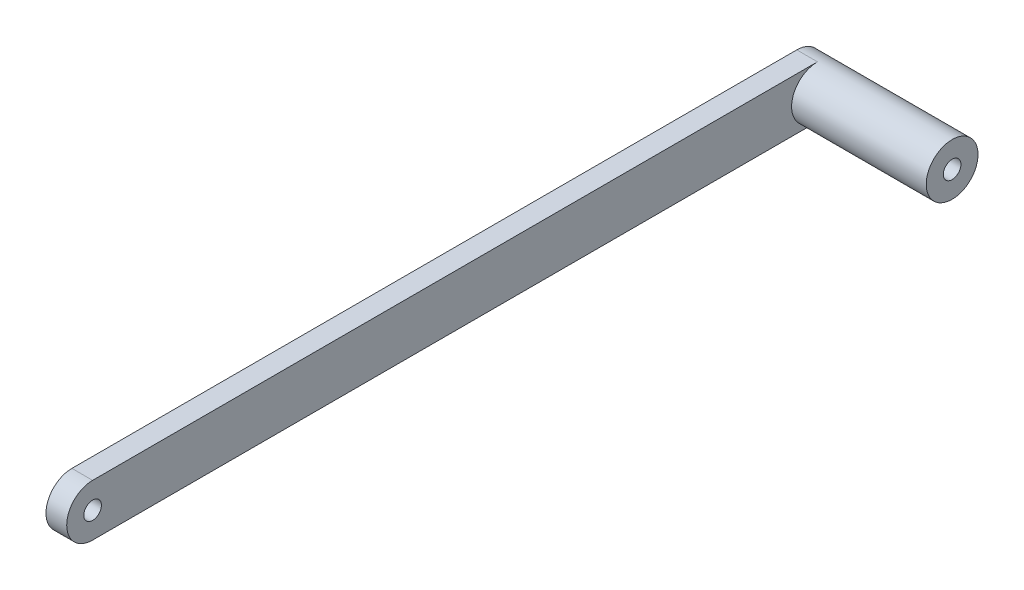
ISO-10303-21;
HEADER;
FILE_DESCRIPTION(('STEP AP214'),'2;1');
FILE_NAME('part.step','',(''),(''),'','','');
FILE_SCHEMA(('AUTOMOTIVE_DESIGN { 1 0 10303 214 1 1 1 1 }'));
ENDSEC;
DATA;
#1=APPLICATION_CONTEXT('core data for automotive mechanical design processes');
#2=APPLICATION_PROTOCOL_DEFINITION('international standard','automotive_design',2000,#1);
#3=PRODUCT_CONTEXT('',#1,'mechanical');
#4=PRODUCT('Part','Part','',(#3));
#5=PRODUCT_RELATED_PRODUCT_CATEGORY('part','',(#4));
#6=PRODUCT_DEFINITION_FORMATION('','',#4);
#7=PRODUCT_DEFINITION_CONTEXT('part definition',#1,'design');
#8=PRODUCT_DEFINITION('design','',#6,#7);
#9=PRODUCT_DEFINITION_SHAPE('','',#8);
#10=(LENGTH_UNIT() NAMED_UNIT(*) SI_UNIT(.MILLI.,.METRE.));
#11=(NAMED_UNIT(*) PLANE_ANGLE_UNIT() SI_UNIT($,.RADIAN.));
#12=(NAMED_UNIT(*) SI_UNIT($,.STERADIAN.) SOLID_ANGLE_UNIT());
#13=UNCERTAINTY_MEASURE_WITH_UNIT(LENGTH_MEASURE(1.E-05),#10,'distance_accuracy_value','');
#14=(GEOMETRIC_REPRESENTATION_CONTEXT(3) GLOBAL_UNCERTAINTY_ASSIGNED_CONTEXT((#13)) GLOBAL_UNIT_ASSIGNED_CONTEXT((#10,
#11,#12)) REPRESENTATION_CONTEXT('',''));
#15=CARTESIAN_POINT('',(0.,0.,0.));
#16=DIRECTION('',(0.,0.,1.));
#17=DIRECTION('',(1.,0.,0.));
#18=AXIS2_PLACEMENT_3D('',#15,#16,#17);
#19=CARTESIAN_POINT('',(2.,0.,35.));
#20=DIRECTION('',(-1.,0.,0.));
#21=DIRECTION('',(0.,0.,1.));
#22=AXIS2_PLACEMENT_3D('',#19,#20,#21);
#23=CYLINDRICAL_SURFACE('',#22,2.5);
#24=CARTESIAN_POINT('',(0.,0.,35.));
#25=DIRECTION('',(1.,0.,0.));
#26=DIRECTION('',(0.,0.,-1.));
#27=AXIS2_PLACEMENT_3D('',#24,#25,#26);
#28=CIRCLE('',#27,2.5);
#29=CARTESIAN_POINT('',(0.,2.5,35.));
#30=VERTEX_POINT('',#29);
#31=CARTESIAN_POINT('',(0.,-2.5,35.));
#32=VERTEX_POINT('',#31);
#33=EDGE_CURVE('E95',#30,#32,#28,.T.);
#34=ORIENTED_EDGE('',*,*,#33,.T.);
#35=DIRECTION('',(-1.,0.,0.));
#36=VECTOR('',#35,1.);
#37=CARTESIAN_POINT('',(2.,-2.5,35.));
#38=LINE('',#37,#36);
#39=CARTESIAN_POINT('',(2.,-2.5,35.));
#40=VERTEX_POINT('',#39);
#41=EDGE_CURVE('E11',#40,#32,#38,.T.);
#42=ORIENTED_EDGE('',*,*,#41,.F.);
#43=CARTESIAN_POINT('',(2.,0.,35.));
#44=DIRECTION('',(1.,0.,0.));
#45=DIRECTION('',(0.,0.,-1.));
#46=AXIS2_PLACEMENT_3D('',#43,#44,#45);
#47=CIRCLE('',#46,2.5);
#48=CARTESIAN_POINT('',(2.,2.5,35.));
#49=VERTEX_POINT('',#48);
#50=EDGE_CURVE('E101',#49,#40,#47,.T.);
#51=ORIENTED_EDGE('',*,*,#50,.F.);
#52=DIRECTION('',(-1.,0.,0.));
#53=VECTOR('',#52,1.);
#54=CARTESIAN_POINT('',(2.,2.5,35.));
#55=LINE('',#54,#53);
#56=EDGE_CURVE('E82',#49,#30,#55,.T.);
#57=ORIENTED_EDGE('',*,*,#56,.T.);
#58=EDGE_LOOP('',(#34,#42,#51,#57));
#59=FACE_BOUND('',#58,.T.);
#60=ADVANCED_FACE('F33',(#59),#23,.T.);
#61=CARTESIAN_POINT('',(2.,-2.5,35.));
#62=DIRECTION('',(0.,1.,0.));
#63=DIRECTION('',(0.,0.,1.));
#64=AXIS2_PLACEMENT_3D('',#61,#62,#63);
#65=PLANE('',#64);
#66=DIRECTION('',(0.,0.,-1.));
#67=VECTOR('',#66,1.);
#68=CARTESIAN_POINT('',(0.,-2.5,35.));
#69=LINE('',#68,#67);
#70=CARTESIAN_POINT('',(0.,-2.49999999999999,-35.));
#71=VERTEX_POINT('',#70);
#72=EDGE_CURVE('E106',#32,#71,#69,.T.);
#73=ORIENTED_EDGE('',*,*,#72,.T.);
#74=DIRECTION('',(-1.,0.,0.));
#75=VECTOR('',#74,1.);
#76=CARTESIAN_POINT('',(2.,-2.49999999999999,-35.));
#77=LINE('',#76,#75);
#78=CARTESIAN_POINT('',(2.,-2.49999999999999,-35.));
#79=VERTEX_POINT('',#78);
#80=EDGE_CURVE('E41',#79,#71,#77,.T.);
#81=ORIENTED_EDGE('',*,*,#80,.F.);
#82=DIRECTION('',(0.,0.,-1.));
#83=VECTOR('',#82,1.);
#84=CARTESIAN_POINT('',(2.,-2.5,35.));
#85=LINE('',#84,#83);
#86=EDGE_CURVE('E78',#40,#79,#85,.T.);
#87=ORIENTED_EDGE('',*,*,#86,.F.);
#88=ORIENTED_EDGE('',*,*,#41,.T.);
#89=EDGE_LOOP('',(#73,#81,#87,#88));
#90=FACE_BOUND('',#89,.T.);
#91=ADVANCED_FACE('F115',(#90),#65,.F.);
#92=CARTESIAN_POINT('',(2.,0.,-35.));
#93=DIRECTION('',(-1.,0.,0.));
#94=DIRECTION('',(0.,0.,1.));
#95=AXIS2_PLACEMENT_3D('',#92,#93,#94);
#96=CYLINDRICAL_SURFACE('',#95,2.5);
#97=CARTESIAN_POINT('',(0.,0.,-35.));
#98=DIRECTION('',(1.,0.,0.));
#99=DIRECTION('',(0.,0.,-1.));
#100=AXIS2_PLACEMENT_3D('',#97,#98,#99);
#101=CIRCLE('',#100,2.5);
#102=CARTESIAN_POINT('',(0.,2.50000000000001,-35.));
#103=VERTEX_POINT('',#102);
#104=EDGE_CURVE('E68',#71,#103,#101,.T.);
#105=ORIENTED_EDGE('',*,*,#104,.T.);
#106=DIRECTION('',(-1.,0.,0.));
#107=VECTOR('',#106,1.);
#108=CARTESIAN_POINT('',(2.,2.50000000000001,-35.));
#109=LINE('',#108,#107);
#110=CARTESIAN_POINT('',(2.,2.50000000000002,-35.));
#111=VERTEX_POINT('',#110);
#112=EDGE_CURVE('E81',#111,#103,#109,.T.);
#113=ORIENTED_EDGE('',*,*,#112,.F.);
#114=CARTESIAN_POINT('',(2.,0.,-35.));
#115=DIRECTION('',(1.,0.,0.));
#116=DIRECTION('',(0.,0.,-1.));
#117=AXIS2_PLACEMENT_3D('',#114,#115,#116);
#118=CIRCLE('',#117,2.5);
#119=EDGE_CURVE('E88',#111,#79,#118,.T.);
#120=ORIENTED_EDGE('',*,*,#119,.T.);
#121=ORIENTED_EDGE('',*,*,#80,.T.);
#122=EDGE_LOOP('',(#105,#113,#120,#121));
#123=FACE_BOUND('',#122,.T.);
#124=CARTESIAN_POINT('',(15.,0.,-35.));
#125=DIRECTION('',(1.,0.,0.));
#126=DIRECTION('',(0.,0.,-1.));
#127=AXIS2_PLACEMENT_3D('',#124,#125,#126);
#128=CIRCLE('',#127,2.5);
#129=CARTESIAN_POINT('',(15.,0.,-37.5));
#130=VERTEX_POINT('',#129);
#131=EDGE_CURVE('E91',#130,#130,#128,.T.);
#132=ORIENTED_EDGE('',*,*,#131,.F.);
#133=EDGE_LOOP('',(#132));
#134=FACE_BOUND('',#133,.T.);
#135=ADVANCED_FACE('F86',(#123,#134),#96,.T.);
#136=CARTESIAN_POINT('',(2.,2.5,35.));
#137=DIRECTION('',(0.,-1.,0.));
#138=DIRECTION('',(0.,0.,-1.));
#139=AXIS2_PLACEMENT_3D('',#136,#137,#138);
#140=PLANE('',#139);
#141=DIRECTION('',(0.,0.,1.));
#142=VECTOR('',#141,1.);
#143=CARTESIAN_POINT('',(0.,2.5,35.));
#144=LINE('',#143,#142);
#145=EDGE_CURVE('E73',#103,#30,#144,.T.);
#146=ORIENTED_EDGE('',*,*,#145,.T.);
#147=ORIENTED_EDGE('',*,*,#56,.F.);
#148=DIRECTION('',(0.,0.,1.));
#149=VECTOR('',#148,1.);
#150=CARTESIAN_POINT('',(2.,2.5,35.));
#151=LINE('',#150,#149);
#152=EDGE_CURVE('E49',#111,#49,#151,.T.);
#153=ORIENTED_EDGE('',*,*,#152,.F.);
#154=ORIENTED_EDGE('',*,*,#112,.T.);
#155=EDGE_LOOP('',(#146,#147,#153,#154));
#156=FACE_BOUND('',#155,.T.);
#157=ADVANCED_FACE('F80',(#156),#140,.F.);
#158=CARTESIAN_POINT('',(2.,0.,35.));
#159=DIRECTION('',(1.,0.,0.));
#160=DIRECTION('',(0.,0.,-1.));
#161=AXIS2_PLACEMENT_3D('',#158,#159,#160);
#162=PLANE('',#161);
#163=CARTESIAN_POINT('',(2.,0.,35.));
#164=DIRECTION('',(1.,0.,0.));
#165=DIRECTION('',(0.,0.,-1.));
#166=AXIS2_PLACEMENT_3D('',#163,#164,#165);
#167=CIRCLE('',#166,0.850000000000007);
#168=CARTESIAN_POINT('',(2.,0.,34.15));
#169=VERTEX_POINT('',#168);
#170=EDGE_CURVE('E147',#169,#169,#167,.T.);
#171=ORIENTED_EDGE('',*,*,#170,.F.);
#172=EDGE_LOOP('',(#171));
#173=FACE_BOUND('',#172,.T.);
#174=ORIENTED_EDGE('',*,*,#119,.F.);
#175=ORIENTED_EDGE('',*,*,#152,.T.);
#176=ORIENTED_EDGE('',*,*,#50,.T.);
#177=ORIENTED_EDGE('',*,*,#86,.T.);
#178=EDGE_LOOP('',(#174,#175,#176,#177));
#179=FACE_BOUND('',#178,.T.);
#180=ADVANCED_FACE('F90',(#173,#179),#162,.T.);
#181=CARTESIAN_POINT('',(0.,0.,35.));
#182=DIRECTION('',(1.,0.,0.));
#183=DIRECTION('',(0.,0.,-1.));
#184=AXIS2_PLACEMENT_3D('',#181,#182,#183);
#185=PLANE('',#184);
#186=CARTESIAN_POINT('',(0.,0.,35.));
#187=DIRECTION('',(1.,0.,0.));
#188=DIRECTION('',(0.,0.,-1.));
#189=AXIS2_PLACEMENT_3D('',#186,#187,#188);
#190=CIRCLE('',#189,0.850000000000007);
#191=CARTESIAN_POINT('',(0.,0.,34.15));
#192=VERTEX_POINT('',#191);
#193=EDGE_CURVE('E150',#192,#192,#190,.F.);
#194=ORIENTED_EDGE('',*,*,#193,.F.);
#195=EDGE_LOOP('',(#194));
#196=FACE_BOUND('',#195,.T.);
#197=CARTESIAN_POINT('',(0.,0.,-35.));
#198=DIRECTION('',(1.,0.,0.));
#199=DIRECTION('',(0.,0.,-1.));
#200=AXIS2_PLACEMENT_3D('',#197,#198,#199);
#201=CIRCLE('',#200,0.850000000000007);
#202=CARTESIAN_POINT('',(0.,0.,-35.85));
#203=VERTEX_POINT('',#202);
#204=EDGE_CURVE('E92',#203,#203,#201,.F.);
#205=ORIENTED_EDGE('',*,*,#204,.F.);
#206=EDGE_LOOP('',(#205));
#207=FACE_BOUND('',#206,.T.);
#208=ORIENTED_EDGE('',*,*,#33,.F.);
#209=ORIENTED_EDGE('',*,*,#145,.F.);
#210=ORIENTED_EDGE('',*,*,#104,.F.);
#211=ORIENTED_EDGE('',*,*,#72,.F.);
#212=EDGE_LOOP('',(#208,#209,#210,#211));
#213=FACE_BOUND('',#212,.T.);
#214=ADVANCED_FACE('F112',(#196,#207,#213),#185,.F.);
#215=CARTESIAN_POINT('',(15.,0.,-35.));
#216=DIRECTION('',(1.,0.,0.));
#217=DIRECTION('',(0.,0.,-1.));
#218=AXIS2_PLACEMENT_3D('',#215,#216,#217);
#219=PLANE('',#218);
#220=CARTESIAN_POINT('',(15.,0.,-35.));
#221=DIRECTION('',(1.,0.,0.));
#222=DIRECTION('',(0.,0.,-1.));
#223=AXIS2_PLACEMENT_3D('',#220,#221,#222);
#224=CIRCLE('',#223,0.850000000000007);
#225=CARTESIAN_POINT('',(15.,0.,-35.85));
#226=VERTEX_POINT('',#225);
#227=EDGE_CURVE('E98',#226,#226,#224,.T.);
#228=ORIENTED_EDGE('',*,*,#227,.F.);
#229=EDGE_LOOP('',(#228));
#230=FACE_BOUND('',#229,.T.);
#231=ORIENTED_EDGE('',*,*,#131,.T.);
#232=EDGE_LOOP('',(#231));
#233=FACE_BOUND('',#232,.T.);
#234=ADVANCED_FACE('F127',(#230,#233),#219,.T.);
#235=CARTESIAN_POINT('',(-0.000999999999999265,0.,-35.));
#236=DIRECTION('',(1.,0.,0.));
#237=DIRECTION('',(0.,0.,-1.));
#238=AXIS2_PLACEMENT_3D('',#235,#236,#237);
#239=CYLINDRICAL_SURFACE('',#238,0.850000000000007);
#240=CARTESIAN_POINT('',(15.,0.,-35.85));
#241=CARTESIAN_POINT('',(14.84375,0.,-35.85));
#242=CARTESIAN_POINT('',(14.6875,0.,-35.85));
#243=CARTESIAN_POINT('',(14.375,0.,-35.85));
#244=CARTESIAN_POINT('',(14.21875,0.,-35.85));
#245=CARTESIAN_POINT('',(13.90625,0.,-35.85));
#246=CARTESIAN_POINT('',(13.75,0.,-35.85));
#247=CARTESIAN_POINT('',(13.4375,0.,-35.85));
#248=CARTESIAN_POINT('',(13.28125,0.,-35.85));
#249=CARTESIAN_POINT('',(12.96875,0.,-35.85));
#250=CARTESIAN_POINT('',(12.8125,0.,-35.85));
#251=CARTESIAN_POINT('',(12.5,0.,-35.85));
#252=CARTESIAN_POINT('',(12.34375,0.,-35.85));
#253=CARTESIAN_POINT('',(12.03125,0.,-35.85));
#254=CARTESIAN_POINT('',(11.875,0.,-35.85));
#255=CARTESIAN_POINT('',(11.5625,0.,-35.85));
#256=CARTESIAN_POINT('',(11.40625,0.,-35.85));
#257=CARTESIAN_POINT('',(11.09375,0.,-35.85));
#258=CARTESIAN_POINT('',(10.9375,0.,-35.85));
#259=CARTESIAN_POINT('',(10.625,0.,-35.85));
#260=CARTESIAN_POINT('',(10.46875,0.,-35.85));
#261=CARTESIAN_POINT('',(10.15625,0.,-35.85));
#262=CARTESIAN_POINT('',(10.,0.,-35.85));
#263=CARTESIAN_POINT('',(9.6875,0.,-35.85));
#264=CARTESIAN_POINT('',(9.53125,0.,-35.85));
#265=CARTESIAN_POINT('',(9.21875,0.,-35.85));
#266=CARTESIAN_POINT('',(9.0625,0.,-35.85));
#267=CARTESIAN_POINT('',(8.75,0.,-35.85));
#268=CARTESIAN_POINT('',(8.59375,0.,-35.85));
#269=CARTESIAN_POINT('',(8.28125,0.,-35.85));
#270=CARTESIAN_POINT('',(8.125,0.,-35.85));
#271=CARTESIAN_POINT('',(7.8125,0.,-35.85));
#272=CARTESIAN_POINT('',(7.65625,0.,-35.85));
#273=CARTESIAN_POINT('',(7.34375,0.,-35.85));
#274=CARTESIAN_POINT('',(7.1875,0.,-35.85));
#275=CARTESIAN_POINT('',(6.875,0.,-35.85));
#276=CARTESIAN_POINT('',(6.71875,0.,-35.85));
#277=CARTESIAN_POINT('',(6.40625,0.,-35.85));
#278=CARTESIAN_POINT('',(6.25,0.,-35.85));
#279=CARTESIAN_POINT('',(5.9375,0.,-35.85));
#280=CARTESIAN_POINT('',(5.78125,0.,-35.85));
#281=CARTESIAN_POINT('',(5.46875,0.,-35.85));
#282=CARTESIAN_POINT('',(5.3125,0.,-35.85));
#283=CARTESIAN_POINT('',(5.,0.,-35.85));
#284=CARTESIAN_POINT('',(4.84375,0.,-35.85));
#285=CARTESIAN_POINT('',(4.53125,0.,-35.85));
#286=CARTESIAN_POINT('',(4.375,0.,-35.85));
#287=CARTESIAN_POINT('',(4.0625,0.,-35.85));
#288=CARTESIAN_POINT('',(3.90625,0.,-35.85));
#289=CARTESIAN_POINT('',(3.59375,0.,-35.85));
#290=CARTESIAN_POINT('',(3.4375,0.,-35.85));
#291=CARTESIAN_POINT('',(3.125,0.,-35.85));
#292=CARTESIAN_POINT('',(2.96875,0.,-35.85));
#293=CARTESIAN_POINT('',(2.65625,0.,-35.85));
#294=CARTESIAN_POINT('',(2.5,0.,-35.85));
#295=CARTESIAN_POINT('',(2.1875,0.,-35.85));
#296=CARTESIAN_POINT('',(2.03125,0.,-35.85));
#297=CARTESIAN_POINT('',(1.71875,0.,-35.85));
#298=CARTESIAN_POINT('',(1.5625,0.,-35.85));
#299=CARTESIAN_POINT('',(1.25,0.,-35.85));
#300=CARTESIAN_POINT('',(1.09375,0.,-35.85));
#301=CARTESIAN_POINT('',(0.781250000000001,0.,-35.85));
#302=CARTESIAN_POINT('',(0.625,0.,-35.85));
#303=CARTESIAN_POINT('',(0.3125,0.,-35.85));
#304=CARTESIAN_POINT('',(0.15625,0.,-35.85));
#305=CARTESIAN_POINT('',(0.,0.,-35.85));
#306=B_SPLINE_CURVE_WITH_KNOTS('',3,(#240,#241,#242,#243,#244,#245,#246,#247,#248,#249,#250,
#251,#252,#253,#254,#255,#256,#257,#258,#259,#260,#261,#262,#263,#264,#265,#266,#267,#268,#269,
#270,#271,#272,#273,#274,#275,#276,#277,#278,#279,#280,#281,#282,#283,#284,#285,#286,#287,#288,
#289,#290,#291,#292,#293,#294,#295,#296,#297,#298,#299,#300,#301,#302,#303,#304,#305),
.UNSPECIFIED.,.F.,.F.,(4,2,2,2,2,2,2,2,2,2,2,2,2,2,2,2,2,2,2,2,2,2,2,2,2,2,2,2,2,2,2,2,4),(0.,
0.46875,0.937500000000001,1.40625,1.875,2.34375,2.8125,3.28125,3.75,4.21875,4.6875,5.15625,
5.625,6.09375,6.5625,7.03125,7.5,7.96875,8.4375,8.90625,9.375,9.84375,10.3125,10.78125,11.25,
11.71875,12.1875,12.65625,13.125,13.59375,14.0625,14.53125,15.),.UNSPECIFIED.);
#307=EDGE_CURVE('BSEAM134',#226,#203,#306,.T.);
#308=ORIENTED_EDGE('',*,*,#227,.T.);
#309=ORIENTED_EDGE('',*,*,#204,.T.);
#310=ORIENTED_EDGE('',*,*,#307,.T.);
#311=ORIENTED_EDGE('',*,*,#307,.F.);
#312=EDGE_LOOP('',(#308,#310,#309,#311));
#313=FACE_BOUND('',#312,.T.);
#314=ADVANCED_FACE('F134',(#313),#239,.F.);
#315=CARTESIAN_POINT('',(-0.00100000000000013,0.,35.));
#316=DIRECTION('',(1.,0.,0.));
#317=DIRECTION('',(0.,0.,-1.));
#318=AXIS2_PLACEMENT_3D('',#315,#316,#317);
#319=CYLINDRICAL_SURFACE('',#318,0.850000000000007);
#320=ORIENTED_EDGE('',*,*,#170,.T.);
#321=EDGE_LOOP('',(#320));
#322=FACE_BOUND('',#321,.T.);
#323=ORIENTED_EDGE('',*,*,#193,.T.);
#324=EDGE_LOOP('',(#323));
#325=FACE_BOUND('',#324,.T.);
#326=ADVANCED_FACE('F138',(#322,#325),#319,.F.);
#327=CLOSED_SHELL('',(#60,#91,#135,#157,#180,#214,#234,#314,#326));
#328=MANIFOLD_SOLID_BREP('B2',#327);
#329=ADVANCED_BREP_SHAPE_REPRESENTATION('',(#18,#328),#14);
#330=SHAPE_DEFINITION_REPRESENTATION(#9,#329);
ENDSEC;
END-ISO-10303-21;
